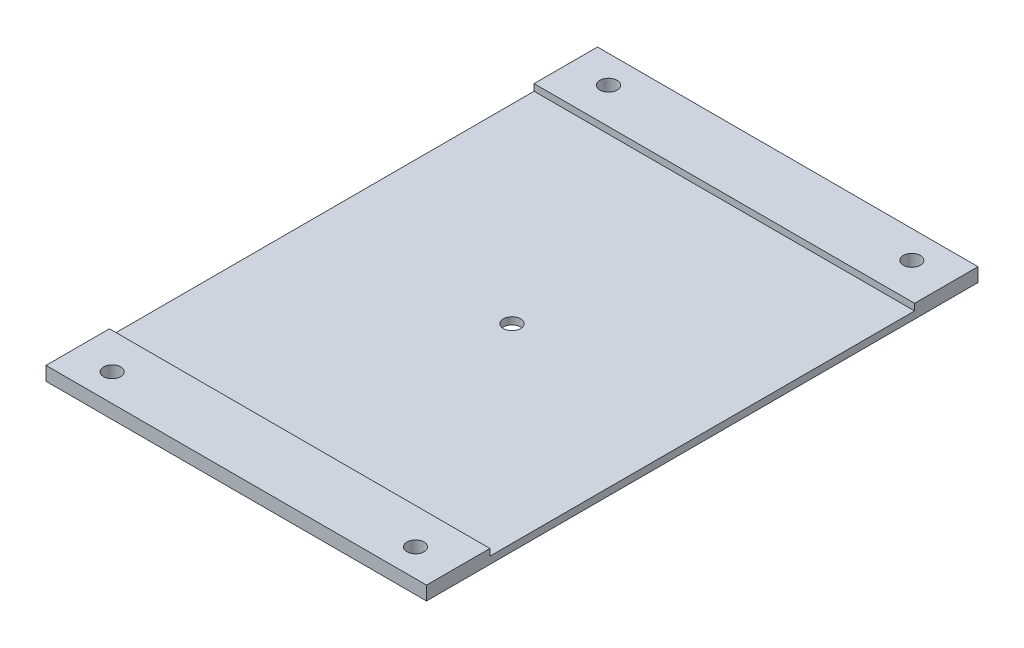
ISO-10303-21;
HEADER;
FILE_DESCRIPTION(('STEP AP214'),'2;1');
FILE_NAME('part.step','',(''),(''),'','','');
FILE_SCHEMA(('AUTOMOTIVE_DESIGN { 1 0 10303 214 1 1 1 1 }'));
ENDSEC;
DATA;
#1=APPLICATION_CONTEXT('core data for automotive mechanical design processes');
#2=APPLICATION_PROTOCOL_DEFINITION('international standard','automotive_design',2000,#1);
#3=PRODUCT_CONTEXT('',#1,'mechanical');
#4=PRODUCT('Part','Part','',(#3));
#5=PRODUCT_RELATED_PRODUCT_CATEGORY('part','',(#4));
#6=PRODUCT_DEFINITION_FORMATION('','',#4);
#7=PRODUCT_DEFINITION_CONTEXT('part definition',#1,'design');
#8=PRODUCT_DEFINITION('design','',#6,#7);
#9=PRODUCT_DEFINITION_SHAPE('','',#8);
#10=(LENGTH_UNIT() NAMED_UNIT(*) SI_UNIT(.MILLI.,.METRE.));
#11=(NAMED_UNIT(*) PLANE_ANGLE_UNIT() SI_UNIT($,.RADIAN.));
#12=(NAMED_UNIT(*) SI_UNIT($,.STERADIAN.) SOLID_ANGLE_UNIT());
#13=UNCERTAINTY_MEASURE_WITH_UNIT(LENGTH_MEASURE(1.E-05),#10,'distance_accuracy_value','');
#14=(GEOMETRIC_REPRESENTATION_CONTEXT(3) GLOBAL_UNCERTAINTY_ASSIGNED_CONTEXT((#13)) GLOBAL_UNIT_ASSIGNED_CONTEXT((#10,
#11,#12)) REPRESENTATION_CONTEXT('',''));
#15=CARTESIAN_POINT('',(0.,0.,0.));
#16=DIRECTION('',(0.,0.,1.));
#17=DIRECTION('',(1.,0.,0.));
#18=AXIS2_PLACEMENT_3D('',#15,#16,#17);
#19=CARTESIAN_POINT('',(0.,2.5,0.));
#20=DIRECTION('',(0.,1.,0.));
#21=DIRECTION('',(0.,0.,1.));
#22=AXIS2_PLACEMENT_3D('',#19,#20,#21);
#23=PLANE('',#22);
#24=CARTESIAN_POINT('',(-27.5,2.5,-45.));
#25=DIRECTION('',(0.,1.,0.));
#26=DIRECTION('',(0.,0.,1.));
#27=AXIS2_PLACEMENT_3D('',#24,#25,#26);
#28=CIRCLE('',#27,1.55);
#29=CARTESIAN_POINT('',(-27.5,2.5,-43.45));
#30=VERTEX_POINT('',#29);
#31=EDGE_CURVE('E333',#30,#30,#28,.T.);
#32=ORIENTED_EDGE('',*,*,#31,.F.);
#33=EDGE_LOOP('',(#32));
#34=FACE_BOUND('',#33,.T.);
#35=CARTESIAN_POINT('',(27.5,2.5,-45.));
#36=DIRECTION('',(0.,1.,0.));
#37=DIRECTION('',(0.,0.,1.));
#38=AXIS2_PLACEMENT_3D('',#35,#36,#37);
#39=CIRCLE('',#38,1.55);
#40=CARTESIAN_POINT('',(27.5,2.5,-43.45));
#41=VERTEX_POINT('',#40);
#42=EDGE_CURVE('E335',#41,#41,#39,.T.);
#43=ORIENTED_EDGE('',*,*,#42,.F.);
#44=EDGE_LOOP('',(#43));
#45=FACE_BOUND('',#44,.T.);
#46=DIRECTION('',(-1.,0.,0.));
#47=VECTOR('',#46,1.);
#48=CARTESIAN_POINT('',(34.5,2.5,-38.5));
#49=LINE('',#48,#47);
#50=CARTESIAN_POINT('',(34.5,2.5,-38.5));
#51=VERTEX_POINT('',#50);
#52=CARTESIAN_POINT('',(-34.5,2.5,-38.5));
#53=VERTEX_POINT('',#52);
#54=EDGE_CURVE('E125',#51,#53,#49,.T.);
#55=ORIENTED_EDGE('',*,*,#54,.F.);
#56=DIRECTION('',(0.,0.,-1.));
#57=VECTOR('',#56,1.);
#58=CARTESIAN_POINT('',(34.5,2.5,-50.));
#59=LINE('',#58,#57);
#60=CARTESIAN_POINT('',(34.5,2.5,-50.));
#61=VERTEX_POINT('',#60);
#62=EDGE_CURVE('E87',#51,#61,#59,.T.);
#63=ORIENTED_EDGE('',*,*,#62,.T.);
#64=DIRECTION('',(-1.,0.,0.));
#65=VECTOR('',#64,1.);
#66=CARTESIAN_POINT('',(-34.5,2.5,-50.));
#67=LINE('',#66,#65);
#68=CARTESIAN_POINT('',(-34.5,2.5,-50.));
#69=VERTEX_POINT('',#68);
#70=EDGE_CURVE('E139',#61,#69,#67,.T.);
#71=ORIENTED_EDGE('',*,*,#70,.T.);
#72=DIRECTION('',(0.,0.,1.));
#73=VECTOR('',#72,1.);
#74=CARTESIAN_POINT('',(-34.5,2.5,-50.));
#75=LINE('',#74,#73);
#76=EDGE_CURVE('E141',#69,#53,#75,.T.);
#77=ORIENTED_EDGE('',*,*,#76,.T.);
#78=EDGE_LOOP('',(#55,#63,#71,#77));
#79=FACE_BOUND('',#78,.T.);
#80=ADVANCED_FACE('F34',(#34,#45,#79),#23,.T.);
#81=CARTESIAN_POINT('',(34.5,2.5,-50.));
#82=DIRECTION('',(-1.,0.,0.));
#83=DIRECTION('',(0.,0.,1.));
#84=AXIS2_PLACEMENT_3D('',#81,#82,#83);
#85=PLANE('',#84);
#86=ORIENTED_EDGE('',*,*,#62,.F.);
#87=DIRECTION('',(0.,1.,0.));
#88=VECTOR('',#87,1.);
#89=CARTESIAN_POINT('',(34.5,1.3,-38.5));
#90=LINE('',#89,#88);
#91=CARTESIAN_POINT('',(34.5,1.3,-38.5));
#92=VERTEX_POINT('',#91);
#93=EDGE_CURVE('E132',#92,#51,#90,.T.);
#94=ORIENTED_EDGE('',*,*,#93,.F.);
#95=DIRECTION('',(0.,0.,-1.));
#96=VECTOR('',#95,1.);
#97=CARTESIAN_POINT('',(34.5,1.3,-38.5));
#98=LINE('',#97,#96);
#99=CARTESIAN_POINT('',(34.5,1.3,38.5));
#100=VERTEX_POINT('',#99);
#101=EDGE_CURVE('E115',#100,#92,#98,.T.);
#102=ORIENTED_EDGE('',*,*,#101,.F.);
#103=DIRECTION('',(0.,1.,0.));
#104=VECTOR('',#103,1.);
#105=CARTESIAN_POINT('',(34.5,1.3,38.5));
#106=LINE('',#105,#104);
#107=CARTESIAN_POINT('',(34.5,2.5,38.5));
#108=VERTEX_POINT('',#107);
#109=EDGE_CURVE('E112',#100,#108,#106,.T.);
#110=ORIENTED_EDGE('',*,*,#109,.T.);
#111=CARTESIAN_POINT('',(34.5,2.5,50.));
#112=VERTEX_POINT('',#111);
#113=EDGE_CURVE('E137',#112,#108,#59,.T.);
#114=ORIENTED_EDGE('',*,*,#113,.F.);
#115=DIRECTION('',(0.,-1.,0.));
#116=VECTOR('',#115,1.);
#117=CARTESIAN_POINT('',(34.5,2.5,50.));
#118=LINE('',#117,#116);
#119=CARTESIAN_POINT('',(34.5,0.,50.));
#120=VERTEX_POINT('',#119);
#121=EDGE_CURVE('E145',#112,#120,#118,.T.);
#122=ORIENTED_EDGE('',*,*,#121,.T.);
#123=DIRECTION('',(0.,0.,-1.));
#124=VECTOR('',#123,1.);
#125=CARTESIAN_POINT('',(34.5,0.,-50.));
#126=LINE('',#125,#124);
#127=CARTESIAN_POINT('',(34.5,0.,-50.));
#128=VERTEX_POINT('',#127);
#129=EDGE_CURVE('E146',#120,#128,#126,.T.);
#130=ORIENTED_EDGE('',*,*,#129,.T.);
#131=DIRECTION('',(0.,-1.,0.));
#132=VECTOR('',#131,1.);
#133=CARTESIAN_POINT('',(34.5,2.5,-50.));
#134=LINE('',#133,#132);
#135=EDGE_CURVE('E11',#61,#128,#134,.T.);
#136=ORIENTED_EDGE('',*,*,#135,.F.);
#137=EDGE_LOOP('',(#86,#94,#102,#110,#114,#122,#130,#136));
#138=FACE_BOUND('',#137,.T.);
#139=ADVANCED_FACE('F36',(#138),#85,.F.);
#140=CARTESIAN_POINT('',(-34.5,2.5,-50.));
#141=DIRECTION('',(0.,0.,1.));
#142=DIRECTION('',(1.,0.,0.));
#143=AXIS2_PLACEMENT_3D('',#140,#141,#142);
#144=PLANE('',#143);
#145=DIRECTION('',(-1.,0.,0.));
#146=VECTOR('',#145,1.);
#147=CARTESIAN_POINT('',(-34.5,0.,-50.));
#148=LINE('',#147,#146);
#149=CARTESIAN_POINT('',(-34.5,0.,-50.));
#150=VERTEX_POINT('',#149);
#151=EDGE_CURVE('E149',#128,#150,#148,.T.);
#152=ORIENTED_EDGE('',*,*,#151,.T.);
#153=DIRECTION('',(0.,-1.,0.));
#154=VECTOR('',#153,1.);
#155=CARTESIAN_POINT('',(-34.5,2.5,-50.));
#156=LINE('',#155,#154);
#157=EDGE_CURVE('E42',#69,#150,#156,.T.);
#158=ORIENTED_EDGE('',*,*,#157,.F.);
#159=ORIENTED_EDGE('',*,*,#70,.F.);
#160=ORIENTED_EDGE('',*,*,#135,.T.);
#161=EDGE_LOOP('',(#152,#158,#159,#160));
#162=FACE_BOUND('',#161,.T.);
#163=ADVANCED_FACE('F178',(#162),#144,.F.);
#164=CARTESIAN_POINT('',(-34.5,2.5,-50.));
#165=DIRECTION('',(1.,0.,0.));
#166=DIRECTION('',(0.,0.,-1.));
#167=AXIS2_PLACEMENT_3D('',#164,#165,#166);
#168=PLANE('',#167);
#169=DIRECTION('',(0.,0.,1.));
#170=VECTOR('',#169,1.);
#171=CARTESIAN_POINT('',(-34.5,1.3,-38.5));
#172=LINE('',#171,#170);
#173=CARTESIAN_POINT('',(-34.5,1.3,-38.5));
#174=VERTEX_POINT('',#173);
#175=CARTESIAN_POINT('',(-34.5,1.3,38.5));
#176=VERTEX_POINT('',#175);
#177=EDGE_CURVE('E116',#174,#176,#172,.T.);
#178=ORIENTED_EDGE('',*,*,#177,.F.);
#179=DIRECTION('',(0.,1.,0.));
#180=VECTOR('',#179,1.);
#181=CARTESIAN_POINT('',(-34.5,1.3,-38.5));
#182=LINE('',#181,#180);
#183=EDGE_CURVE('E150',#174,#53,#182,.T.);
#184=ORIENTED_EDGE('',*,*,#183,.T.);
#185=ORIENTED_EDGE('',*,*,#76,.F.);
#186=ORIENTED_EDGE('',*,*,#157,.T.);
#187=DIRECTION('',(0.,0.,1.));
#188=VECTOR('',#187,1.);
#189=CARTESIAN_POINT('',(-34.5,0.,-50.));
#190=LINE('',#189,#188);
#191=CARTESIAN_POINT('',(-34.5,0.,50.));
#192=VERTEX_POINT('',#191);
#193=EDGE_CURVE('E152',#150,#192,#190,.T.);
#194=ORIENTED_EDGE('',*,*,#193,.T.);
#195=DIRECTION('',(0.,-1.,0.));
#196=VECTOR('',#195,1.);
#197=CARTESIAN_POINT('',(-34.5,2.5,50.));
#198=LINE('',#197,#196);
#199=CARTESIAN_POINT('',(-34.5,2.5,50.));
#200=VERTEX_POINT('',#199);
#201=EDGE_CURVE('E156',#200,#192,#198,.T.);
#202=ORIENTED_EDGE('',*,*,#201,.F.);
#203=CARTESIAN_POINT('',(-34.5,2.5,38.5));
#204=VERTEX_POINT('',#203);
#205=EDGE_CURVE('E130',#204,#200,#75,.T.);
#206=ORIENTED_EDGE('',*,*,#205,.F.);
#207=DIRECTION('',(0.,1.,0.));
#208=VECTOR('',#207,1.);
#209=CARTESIAN_POINT('',(-34.5,1.3,38.5));
#210=LINE('',#209,#208);
#211=EDGE_CURVE('E49',#176,#204,#210,.T.);
#212=ORIENTED_EDGE('',*,*,#211,.F.);
#213=EDGE_LOOP('',(#178,#184,#185,#186,#194,#202,#206,#212));
#214=FACE_BOUND('',#213,.T.);
#215=ADVANCED_FACE('F128',(#214),#168,.F.);
#216=CARTESIAN_POINT('',(-34.5,2.5,50.));
#217=DIRECTION('',(0.,0.,-1.));
#218=DIRECTION('',(-1.,0.,0.));
#219=AXIS2_PLACEMENT_3D('',#216,#217,#218);
#220=PLANE('',#219);
#221=DIRECTION('',(1.,0.,0.));
#222=VECTOR('',#221,1.);
#223=CARTESIAN_POINT('',(-34.5,0.,50.));
#224=LINE('',#223,#222);
#225=EDGE_CURVE('E79',#192,#120,#224,.T.);
#226=ORIENTED_EDGE('',*,*,#225,.T.);
#227=ORIENTED_EDGE('',*,*,#121,.F.);
#228=DIRECTION('',(1.,0.,0.));
#229=VECTOR('',#228,1.);
#230=CARTESIAN_POINT('',(-34.5,2.5,50.));
#231=LINE('',#230,#229);
#232=EDGE_CURVE('E58',#200,#112,#231,.T.);
#233=ORIENTED_EDGE('',*,*,#232,.F.);
#234=ORIENTED_EDGE('',*,*,#201,.T.);
#235=EDGE_LOOP('',(#226,#227,#233,#234));
#236=FACE_BOUND('',#235,.T.);
#237=ADVANCED_FACE('F168',(#236),#220,.F.);
#238=CARTESIAN_POINT('',(-27.5,2.5,45.));
#239=DIRECTION('',(0.,1.,0.));
#240=DIRECTION('',(0.,0.,1.));
#241=AXIS2_PLACEMENT_3D('',#238,#239,#240);
#242=CIRCLE('',#241,1.55);
#243=CARTESIAN_POINT('',(-27.5,2.5,46.55));
#244=VERTEX_POINT('',#243);
#245=EDGE_CURVE('E341',#244,#244,#242,.T.);
#246=ORIENTED_EDGE('',*,*,#245,.F.);
#247=EDGE_LOOP('',(#246));
#248=FACE_BOUND('',#247,.T.);
#249=CARTESIAN_POINT('',(27.5,2.5,45.));
#250=DIRECTION('',(0.,1.,0.));
#251=DIRECTION('',(0.,0.,1.));
#252=AXIS2_PLACEMENT_3D('',#249,#250,#251);
#253=CIRCLE('',#252,1.55);
#254=CARTESIAN_POINT('',(27.5,2.5,46.55));
#255=VERTEX_POINT('',#254);
#256=EDGE_CURVE('E222',#255,#255,#253,.T.);
#257=ORIENTED_EDGE('',*,*,#256,.F.);
#258=EDGE_LOOP('',(#257));
#259=FACE_BOUND('',#258,.T.);
#260=DIRECTION('',(1.,0.,0.));
#261=VECTOR('',#260,1.);
#262=CARTESIAN_POINT('',(34.5,2.5,38.5));
#263=LINE('',#262,#261);
#264=EDGE_CURVE('E220',#204,#108,#263,.T.);
#265=ORIENTED_EDGE('',*,*,#264,.F.);
#266=ORIENTED_EDGE('',*,*,#205,.T.);
#267=ORIENTED_EDGE('',*,*,#232,.T.);
#268=ORIENTED_EDGE('',*,*,#113,.T.);
#269=EDGE_LOOP('',(#265,#266,#267,#268));
#270=FACE_BOUND('',#269,.T.);
#271=ADVANCED_FACE('F170',(#248,#259,#270),#23,.T.);
#272=CARTESIAN_POINT('',(0.,0.,0.));
#273=DIRECTION('',(0.,1.,0.));
#274=DIRECTION('',(0.,0.,1.));
#275=AXIS2_PLACEMENT_3D('',#272,#273,#274);
#276=PLANE('',#275);
#277=CARTESIAN_POINT('',(-27.5,0.,-45.));
#278=DIRECTION('',(0.,1.,0.));
#279=DIRECTION('',(0.,0.,1.));
#280=AXIS2_PLACEMENT_3D('',#277,#278,#279);
#281=CIRCLE('',#280,1.55);
#282=CARTESIAN_POINT('',(-27.5,0.,-43.45));
#283=VERTEX_POINT('',#282);
#284=EDGE_CURVE('E200',#283,#283,#281,.T.);
#285=ORIENTED_EDGE('',*,*,#284,.T.);
#286=EDGE_LOOP('',(#285));
#287=FACE_BOUND('',#286,.T.);
#288=CARTESIAN_POINT('',(27.5,0.,-45.));
#289=DIRECTION('',(0.,1.,0.));
#290=DIRECTION('',(0.,0.,1.));
#291=AXIS2_PLACEMENT_3D('',#288,#289,#290);
#292=CIRCLE('',#291,1.55);
#293=CARTESIAN_POINT('',(27.5,0.,-43.45));
#294=VERTEX_POINT('',#293);
#295=EDGE_CURVE('E204',#294,#294,#292,.T.);
#296=ORIENTED_EDGE('',*,*,#295,.T.);
#297=EDGE_LOOP('',(#296));
#298=FACE_BOUND('',#297,.T.);
#299=CARTESIAN_POINT('',(-27.5,0.,45.));
#300=DIRECTION('',(0.,1.,0.));
#301=DIRECTION('',(0.,0.,1.));
#302=AXIS2_PLACEMENT_3D('',#299,#300,#301);
#303=CIRCLE('',#302,1.55);
#304=CARTESIAN_POINT('',(-27.5,0.,46.55));
#305=VERTEX_POINT('',#304);
#306=EDGE_CURVE('E208',#305,#305,#303,.T.);
#307=ORIENTED_EDGE('',*,*,#306,.T.);
#308=EDGE_LOOP('',(#307));
#309=FACE_BOUND('',#308,.T.);
#310=CARTESIAN_POINT('',(27.5,0.,45.));
#311=DIRECTION('',(0.,1.,0.));
#312=DIRECTION('',(0.,0.,1.));
#313=AXIS2_PLACEMENT_3D('',#310,#311,#312);
#314=CIRCLE('',#313,1.55);
#315=CARTESIAN_POINT('',(27.5,0.,46.55));
#316=VERTEX_POINT('',#315);
#317=EDGE_CURVE('E212',#316,#316,#314,.T.);
#318=ORIENTED_EDGE('',*,*,#317,.T.);
#319=EDGE_LOOP('',(#318));
#320=FACE_BOUND('',#319,.T.);
#321=CARTESIAN_POINT('',(0.,0.,0.));
#322=DIRECTION('',(0.,1.,0.));
#323=DIRECTION('',(0.,0.,1.));
#324=AXIS2_PLACEMENT_3D('',#321,#322,#323);
#325=CIRCLE('',#324,1.55);
#326=CARTESIAN_POINT('',(0.,0.,1.55));
#327=VERTEX_POINT('',#326);
#328=EDGE_CURVE('E215',#327,#327,#325,.T.);
#329=ORIENTED_EDGE('',*,*,#328,.T.);
#330=EDGE_LOOP('',(#329));
#331=FACE_BOUND('',#330,.T.);
#332=ORIENTED_EDGE('',*,*,#129,.F.);
#333=ORIENTED_EDGE('',*,*,#225,.F.);
#334=ORIENTED_EDGE('',*,*,#193,.F.);
#335=ORIENTED_EDGE('',*,*,#151,.F.);
#336=EDGE_LOOP('',(#332,#333,#334,#335));
#337=FACE_BOUND('',#336,.T.);
#338=ADVANCED_FACE('F164',(#287,#298,#309,#320,#331,#337),#276,.F.);
#339=CARTESIAN_POINT('',(34.5,1.3,-38.5));
#340=DIRECTION('',(0.,0.,-1.));
#341=DIRECTION('',(-1.,0.,0.));
#342=AXIS2_PLACEMENT_3D('',#339,#340,#341);
#343=PLANE('',#342);
#344=ORIENTED_EDGE('',*,*,#54,.T.);
#345=ORIENTED_EDGE('',*,*,#183,.F.);
#346=DIRECTION('',(-1.,0.,0.));
#347=VECTOR('',#346,1.);
#348=CARTESIAN_POINT('',(34.5,1.3,-38.5));
#349=LINE('',#348,#347);
#350=EDGE_CURVE('E122',#92,#174,#349,.T.);
#351=ORIENTED_EDGE('',*,*,#350,.F.);
#352=ORIENTED_EDGE('',*,*,#93,.T.);
#353=EDGE_LOOP('',(#344,#345,#351,#352));
#354=FACE_BOUND('',#353,.T.);
#355=ADVANCED_FACE('F191',(#354),#343,.F.);
#356=CARTESIAN_POINT('',(34.5,1.3,38.5));
#357=DIRECTION('',(0.,0.,1.));
#358=DIRECTION('',(1.,0.,0.));
#359=AXIS2_PLACEMENT_3D('',#356,#357,#358);
#360=PLANE('',#359);
#361=ORIENTED_EDGE('',*,*,#264,.T.);
#362=ORIENTED_EDGE('',*,*,#109,.F.);
#363=DIRECTION('',(1.,0.,0.));
#364=VECTOR('',#363,1.);
#365=CARTESIAN_POINT('',(34.5,1.3,38.5));
#366=LINE('',#365,#364);
#367=EDGE_CURVE('E108',#176,#100,#366,.T.);
#368=ORIENTED_EDGE('',*,*,#367,.F.);
#369=ORIENTED_EDGE('',*,*,#211,.T.);
#370=EDGE_LOOP('',(#361,#362,#368,#369));
#371=FACE_BOUND('',#370,.T.);
#372=ADVANCED_FACE('F110',(#371),#360,.F.);
#373=CARTESIAN_POINT('',(0.,1.3,0.));
#374=DIRECTION('',(0.,-1.,0.));
#375=DIRECTION('',(0.,0.,-1.));
#376=AXIS2_PLACEMENT_3D('',#373,#374,#375);
#377=PLANE('',#376);
#378=CARTESIAN_POINT('',(0.,1.3,0.));
#379=DIRECTION('',(0.,-1.,0.));
#380=DIRECTION('',(0.,0.,-1.));
#381=AXIS2_PLACEMENT_3D('',#378,#379,#380);
#382=CIRCLE('',#381,1.55);
#383=CARTESIAN_POINT('',(0.,1.3,-1.55));
#384=VERTEX_POINT('',#383);
#385=EDGE_CURVE('E217',#384,#384,#382,.T.);
#386=ORIENTED_EDGE('',*,*,#385,.T.);
#387=EDGE_LOOP('',(#386));
#388=FACE_BOUND('',#387,.T.);
#389=ORIENTED_EDGE('',*,*,#177,.T.);
#390=ORIENTED_EDGE('',*,*,#367,.T.);
#391=ORIENTED_EDGE('',*,*,#101,.T.);
#392=ORIENTED_EDGE('',*,*,#350,.T.);
#393=EDGE_LOOP('',(#389,#390,#391,#392));
#394=FACE_BOUND('',#393,.T.);
#395=ADVANCED_FACE('F120',(#388,#394),#377,.F.);
#396=CARTESIAN_POINT('',(0.,2.5,0.));
#397=DIRECTION('',(0.,1.,0.));
#398=DIRECTION('',(0.,0.,1.));
#399=AXIS2_PLACEMENT_3D('',#396,#397,#398);
#400=CYLINDRICAL_SURFACE('',#399,1.55);
#401=ORIENTED_EDGE('',*,*,#328,.F.);
#402=EDGE_LOOP('',(#401));
#403=FACE_BOUND('',#402,.T.);
#404=ORIENTED_EDGE('',*,*,#385,.F.);
#405=EDGE_LOOP('',(#404));
#406=FACE_BOUND('',#405,.T.);
#407=ADVANCED_FACE('F278',(#403,#406),#400,.F.);
#408=CARTESIAN_POINT('',(27.5,2.5,45.));
#409=DIRECTION('',(0.,1.,0.));
#410=DIRECTION('',(0.,0.,1.));
#411=AXIS2_PLACEMENT_3D('',#408,#409,#410);
#412=CYLINDRICAL_SURFACE('',#411,1.55);
#413=ORIENTED_EDGE('',*,*,#317,.F.);
#414=EDGE_LOOP('',(#413));
#415=FACE_BOUND('',#414,.T.);
#416=ORIENTED_EDGE('',*,*,#256,.T.);
#417=EDGE_LOOP('',(#416));
#418=FACE_BOUND('',#417,.T.);
#419=ADVANCED_FACE('F288',(#415,#418),#412,.F.);
#420=CARTESIAN_POINT('',(-27.5,2.5,45.));
#421=DIRECTION('',(0.,1.,0.));
#422=DIRECTION('',(0.,0.,1.));
#423=AXIS2_PLACEMENT_3D('',#420,#421,#422);
#424=CYLINDRICAL_SURFACE('',#423,1.55);
#425=ORIENTED_EDGE('',*,*,#306,.F.);
#426=EDGE_LOOP('',(#425));
#427=FACE_BOUND('',#426,.T.);
#428=ORIENTED_EDGE('',*,*,#245,.T.);
#429=EDGE_LOOP('',(#428));
#430=FACE_BOUND('',#429,.T.);
#431=ADVANCED_FACE('F297',(#427,#430),#424,.F.);
#432=CARTESIAN_POINT('',(27.5,2.5,-45.));
#433=DIRECTION('',(0.,1.,0.));
#434=DIRECTION('',(0.,0.,1.));
#435=AXIS2_PLACEMENT_3D('',#432,#433,#434);
#436=CYLINDRICAL_SURFACE('',#435,1.55);
#437=ORIENTED_EDGE('',*,*,#295,.F.);
#438=EDGE_LOOP('',(#437));
#439=FACE_BOUND('',#438,.T.);
#440=ORIENTED_EDGE('',*,*,#42,.T.);
#441=EDGE_LOOP('',(#440));
#442=FACE_BOUND('',#441,.T.);
#443=ADVANCED_FACE('F307',(#439,#442),#436,.F.);
#444=CARTESIAN_POINT('',(-27.5,2.5,-45.));
#445=DIRECTION('',(0.,1.,0.));
#446=DIRECTION('',(0.,0.,1.));
#447=AXIS2_PLACEMENT_3D('',#444,#445,#446);
#448=CYLINDRICAL_SURFACE('',#447,1.55);
#449=ORIENTED_EDGE('',*,*,#284,.F.);
#450=EDGE_LOOP('',(#449));
#451=FACE_BOUND('',#450,.T.);
#452=ORIENTED_EDGE('',*,*,#31,.T.);
#453=EDGE_LOOP('',(#452));
#454=FACE_BOUND('',#453,.T.);
#455=ADVANCED_FACE('F317',(#451,#454),#448,.F.);
#456=CLOSED_SHELL('',(#80,#139,#163,#215,#237,#271,#338,#355,#372,#395,#407,#419,#431,#443,#455));
#457=MANIFOLD_SOLID_BREP('B2',#456);
#458=ADVANCED_BREP_SHAPE_REPRESENTATION('',(#18,#457),#14);
#459=SHAPE_DEFINITION_REPRESENTATION(#9,#458);
ENDSEC;
END-ISO-10303-21;
